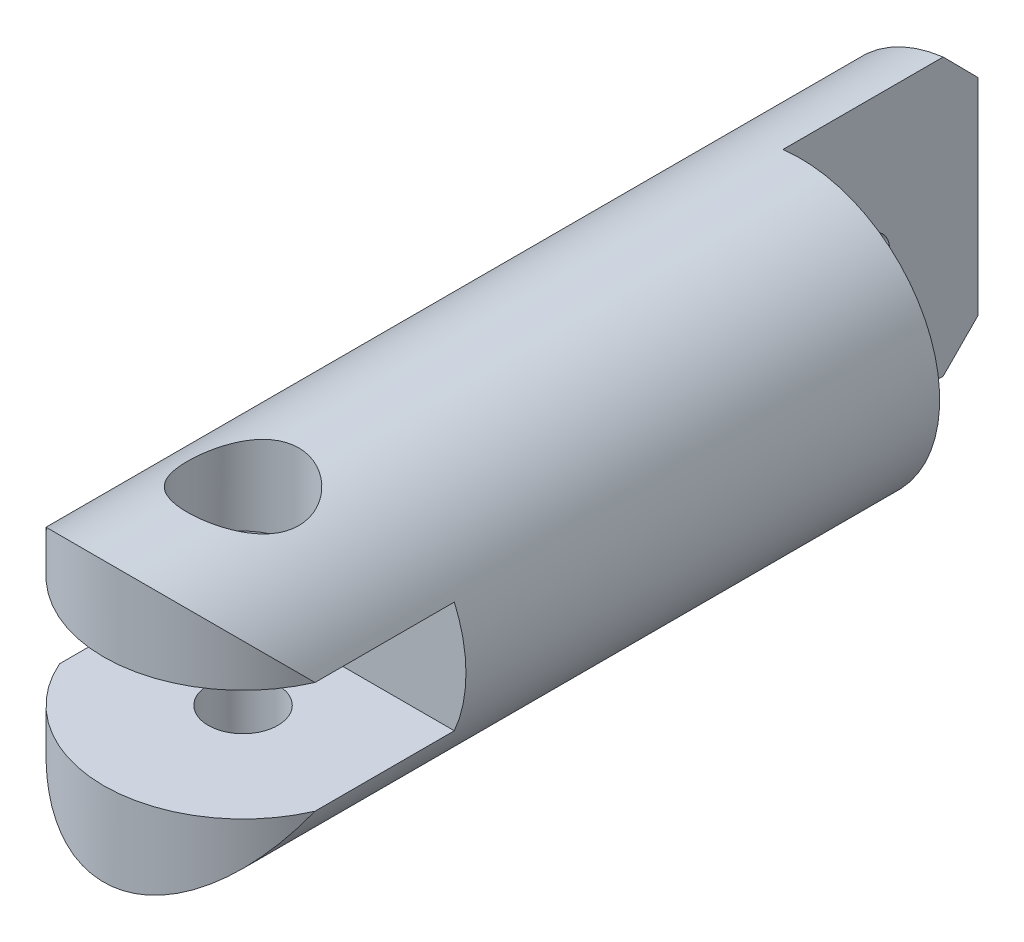
ISO-10303-21;
HEADER;
FILE_DESCRIPTION(('STEP AP214'),'2;1');
FILE_NAME('part.step','',(''),(''),'','','');
FILE_SCHEMA(('AUTOMOTIVE_DESIGN { 1 0 10303 214 1 1 1 1 }'));
ENDSEC;
DATA;
#1=APPLICATION_CONTEXT('core data for automotive mechanical design processes');
#2=APPLICATION_PROTOCOL_DEFINITION('international standard','automotive_design',2000,#1);
#3=PRODUCT_CONTEXT('',#1,'mechanical');
#4=PRODUCT('Part','Part','',(#3));
#5=PRODUCT_RELATED_PRODUCT_CATEGORY('part','',(#4));
#6=PRODUCT_DEFINITION_FORMATION('','',#4);
#7=PRODUCT_DEFINITION_CONTEXT('part definition',#1,'design');
#8=PRODUCT_DEFINITION('design','',#6,#7);
#9=PRODUCT_DEFINITION_SHAPE('','',#8);
#10=(LENGTH_UNIT() NAMED_UNIT(*) SI_UNIT(.MILLI.,.METRE.));
#11=(NAMED_UNIT(*) PLANE_ANGLE_UNIT() SI_UNIT($,.RADIAN.));
#12=(NAMED_UNIT(*) SI_UNIT($,.STERADIAN.) SOLID_ANGLE_UNIT());
#13=UNCERTAINTY_MEASURE_WITH_UNIT(LENGTH_MEASURE(1.E-05),#10,'distance_accuracy_value','');
#14=(GEOMETRIC_REPRESENTATION_CONTEXT(3) GLOBAL_UNCERTAINTY_ASSIGNED_CONTEXT((#13)) GLOBAL_UNIT_ASSIGNED_CONTEXT((#10,
#11,#12)) REPRESENTATION_CONTEXT('',''));
#15=CARTESIAN_POINT('',(0.,0.,0.));
#16=DIRECTION('',(0.,0.,1.));
#17=DIRECTION('',(1.,0.,0.));
#18=AXIS2_PLACEMENT_3D('',#15,#16,#17);
#19=CARTESIAN_POINT('',(0.,87.4642784226795,54.));
#20=DIRECTION('',(0.,-1.,0.));
#21=DIRECTION('',(0.,0.,-1.));
#22=AXIS2_PLACEMENT_3D('',#19,#20,#21);
#23=CYLINDRICAL_SURFACE('',#22,10.);
#24=CARTESIAN_POINT('',(0.,-3.99999999999999,54.));
#25=DIRECTION('',(0.,1.,0.));
#26=DIRECTION('',(0.,0.,1.));
#27=AXIS2_PLACEMENT_3D('',#24,#25,#26);
#28=CIRCLE('',#27,10.);
#29=CARTESIAN_POINT('',(-9.16515138991168,-3.99999999999999,58.));
#30=VERTEX_POINT('',#29);
#31=CARTESIAN_POINT('',(9.16515138991168,-3.99999999999999,58.));
#32=VERTEX_POINT('',#31);
#33=EDGE_CURVE('E94',#30,#32,#28,.T.);
#34=ORIENTED_EDGE('',*,*,#33,.F.);
#35=CARTESIAN_POINT('',(0.,0.,54.));
#36=DIRECTION('',(0.,-0.707106781186547,-0.707106781186547));
#37=DIRECTION('',(0.,0.707106781186547,-0.707106781186547));
#38=AXIS2_PLACEMENT_3D('',#35,#36,#37);
#39=ELLIPSE('',#38,14.1421356237309,10.);
#40=EDGE_CURVE('E92',#32,#30,#39,.T.);
#41=ORIENTED_EDGE('',*,*,#40,.F.);
#42=EDGE_LOOP('',(#34,#41));
#43=FACE_BOUND('',#42,.T.);
#44=ADVANCED_FACE('F34',(#43),#23,.T.);
#45=CARTESIAN_POINT('',(0.,0.,64.));
#46=DIRECTION('',(0.,0.,-1.));
#47=DIRECTION('',(-1.,0.,0.));
#48=AXIS2_PLACEMENT_3D('',#45,#46,#47);
#49=CYLINDRICAL_SURFACE('',#48,10.);
#50=CARTESIAN_POINT('',(0.,-10.,56.5));
#51=CARTESIAN_POINT('',(0.138126814449552,-9.99999766446687,56.4999961237697));
#52=CARTESIAN_POINT('',(0.276296929717939,-9.99710963553043,56.4885140820437));
#53=CARTESIAN_POINT('',(0.548677206284221,-9.98586856383157,56.442958081155));
#54=CARTESIAN_POINT('',(0.682885078117899,-9.97751242366626,56.4088713174369));
#55=CARTESIAN_POINT('',(0.943368120304295,-9.9562604388672,56.3192679108965));
#56=CARTESIAN_POINT('',(1.06965260571667,-9.94337004736763,56.2637770021412));
#57=CARTESIAN_POINT('',(1.31112021984071,-9.91442239679369,56.1330310165919));
#58=CARTESIAN_POINT('',(1.42630297391461,-9.89836503090261,56.0577752731351));
#59=CARTESIAN_POINT('',(1.64466987883486,-9.86445689319489,55.8879986839097));
#60=CARTESIAN_POINT('',(1.74759281676843,-9.84657845246877,55.7931473750682));
#61=CARTESIAN_POINT('',(1.93624821200553,-9.8112270019656,55.5875796584849));
#62=CARTESIAN_POINT('',(2.02197872824865,-9.79375403816446,55.4768614617551));
#63=CARTESIAN_POINT('',(2.17504423799829,-9.76091292830281,55.240674622105));
#64=CARTESIAN_POINT('',(2.2420870265419,-9.74557990774685,55.1150112819854));
#65=CARTESIAN_POINT('',(2.35399484758458,-9.71915824696694,54.8537526472333));
#66=CARTESIAN_POINT('',(2.39886342573357,-9.7080689282403,54.7181589444466));
#67=CARTESIAN_POINT('',(2.46425806134127,-9.69167461160538,54.4437608363306));
#68=CARTESIAN_POINT('',(2.48525378055342,-9.68625818328352,54.30507517327));
#69=CARTESIAN_POINT('',(2.50376962511068,-9.68148937432652,54.0260523850011));
#70=CARTESIAN_POINT('',(2.50129356969685,-9.68213600713214,53.8857155321798));
#71=CARTESIAN_POINT('',(2.47331087439951,-9.68932009194695,53.6109736537577));
#72=CARTESIAN_POINT('',(2.44836390031772,-9.69571438345489,53.4765072975578));
#73=CARTESIAN_POINT('',(2.37704031150499,-9.71344516118448,53.2137315818149));
#74=CARTESIAN_POINT('',(2.33066217011566,-9.72478199948731,53.0854226616185));
#75=CARTESIAN_POINT('',(2.21731579656198,-9.75125189842765,52.8371033062464));
#76=CARTESIAN_POINT('',(2.1501444453882,-9.76642212449693,52.717189713684));
#77=CARTESIAN_POINT('',(1.99726046002491,-9.79882851409985,52.4901354837386));
#78=CARTESIAN_POINT('',(1.91154458134806,-9.81606503891046,52.3829970865546));
#79=CARTESIAN_POINT('',(1.72110570780203,-9.85126467566485,52.181327307176));
#80=CARTESIAN_POINT('',(1.61591043027643,-9.86923449130001,52.0872425165644));
#81=CARTESIAN_POINT('',(1.39101986250616,-9.90343275964594,51.9179645958935));
#82=CARTESIAN_POINT('',(1.27132412951324,-9.91966115915679,51.8427720428941));
#83=CARTESIAN_POINT('',(1.02019314780232,-9.9486288682365,51.7132490229594));
#84=CARTESIAN_POINT('',(0.888718988681037,-9.96135600212878,51.6589910995759));
#85=CARTESIAN_POINT('',(0.618126680238139,-9.98179861652361,51.5734711571507));
#86=CARTESIAN_POINT('',(0.479009998584143,-9.98951505565468,51.5422047393031));
#87=CARTESIAN_POINT('',(0.200899950650048,-9.99892498785624,51.5042373907353));
#88=CARTESIAN_POINT('',(0.0619945333136865,-10.0007675584713,51.4969282898745));
#89=CARTESIAN_POINT('',(-0.215054791335845,-9.99864674690754,51.5054150034258));
#90=CARTESIAN_POINT('',(-0.353198766074325,-9.99468388736421,51.5212087379986));
#91=CARTESIAN_POINT('',(-0.622690447960815,-9.98149301878918,51.5749515139856));
#92=CARTESIAN_POINT('',(-0.754108531614581,-9.97234390309647,51.6125687724616));
#93=CARTESIAN_POINT('',(-1.00876215408752,-9.94981177723595,51.7085118067141));
#94=CARTESIAN_POINT('',(-1.13199686505442,-9.93642833949965,51.7668396738554));
#95=CARTESIAN_POINT('',(-1.36920522404972,-9.9065551321037,51.9037268814578));
#96=CARTESIAN_POINT('',(-1.48297573639294,-9.89001445610999,51.9826268539943));
#97=CARTESIAN_POINT('',(-1.69587768940552,-9.85574181979586,52.1579831813286));
#98=CARTESIAN_POINT('',(-1.79500659828875,-9.83800965421577,52.2544425660294));
#99=CARTESIAN_POINT('',(-1.97831761345414,-9.80281594932498,52.4650032680728));
#100=CARTESIAN_POINT('',(-2.06207311270184,-9.78537173637463,52.5794795049993));
#101=CARTESIAN_POINT('',(-2.20918459835604,-9.75321463970069,52.8212210574476));
#102=CARTESIAN_POINT('',(-2.27254149026901,-9.73850163474941,52.9484858049507));
#103=CARTESIAN_POINT('',(-2.37658570101223,-9.71363491194665,53.2115095373437));
#104=CARTESIAN_POINT('',(-2.41740732773931,-9.70345425375808,53.3472127138538));
#105=CARTESIAN_POINT('',(-2.47557609990489,-9.68877906706585,53.6238493964255));
#106=CARTESIAN_POINT('',(-2.49292837912652,-9.68428329504044,53.7647817517024));
#107=CARTESIAN_POINT('',(-2.50339765056083,-9.68158168701612,54.0435350397693));
#108=CARTESIAN_POINT('',(-2.49719649630132,-9.68319887888034,54.1813290585441));
#109=CARTESIAN_POINT('',(-2.46229546385366,-9.69213181672143,54.4538398144438));
#110=CARTESIAN_POINT('',(-2.43359603781099,-9.69944744817731,54.5885566133553));
#111=CARTESIAN_POINT('',(-2.35488553240496,-9.71885434473221,54.8503474317764));
#112=CARTESIAN_POINT('',(-2.30500234113404,-9.73091692061056,54.9774621754005));
#113=CARTESIAN_POINT('',(-2.18544152267504,-9.75846259540839,55.2216089711893));
#114=CARTESIAN_POINT('',(-2.11576115005696,-9.77394616867808,55.3386396219781));
#115=CARTESIAN_POINT('',(-1.95644624772858,-9.80709390439337,55.5625910483368));
#116=CARTESIAN_POINT('',(-1.86633860485376,-9.82480441386302,55.6691684557066));
#117=CARTESIAN_POINT('',(-1.66964895198289,-9.86013378743769,55.8659117413257));
#118=CARTESIAN_POINT('',(-1.56306303543524,-9.87775262878422,55.9560737168549));
#119=CARTESIAN_POINT('',(-1.33411264450432,-9.91129426079449,56.1190188476077));
#120=CARTESIAN_POINT('',(-1.21149737052731,-9.92718055609783,56.1914576894526));
#121=CARTESIAN_POINT('',(-0.955443432517461,-9.95508208291861,56.3145791049009));
#122=CARTESIAN_POINT('',(-0.822012605727901,-9.96710008666301,56.3652772677476));
#123=CARTESIAN_POINT('',(-0.574017088739122,-9.98413432609236,56.4359530505494));
#124=CARTESIAN_POINT('',(-0.460633618180116,-9.99004308421151,56.4599187384224));
#125=CARTESIAN_POINT('',(-0.231510119227139,-9.9979767538658,56.4919432393699));
#126=CARTESIAN_POINT('',(-0.115770268737694,-10.0000019575149,56.5000032488422));
#127=CARTESIAN_POINT('',(0.,-10.,56.5));
#128=B_SPLINE_CURVE_WITH_KNOTS('',3,(#50,#51,#52,#53,#54,#55,#56,#57,#58,#59,#60,#61,#62,#63,
#64,#65,#66,#67,#68,#69,#70,#71,#72,#73,#74,#75,#76,#77,#78,#79,#80,#81,#82,#83,#84,#85,#86,#87,
#88,#89,#90,#91,#92,#93,#94,#95,#96,#97,#98,#99,#100,#101,#102,#103,#104,#105,#106,#107,#108,
#109,#110,#111,#112,#113,#114,#115,#116,#117,#118,#119,#120,#121,#122,#123,#124,#125,#126,#127),
.UNSPECIFIED.,.T.,.F.,(4,2,2,2,2,2,2,2,2,2,2,2,2,2,2,2,2,2,2,2,2,2,2,2,2,2,2,2,2,2,2,2,2,2,2,2,
2,2,4),(0.,0.413956187453149,0.828147062939833,1.24184150381018,1.65554990028222,
2.07690725728565,2.4983121596677,2.92597745909679,3.35357435282282,3.77260491835116,
4.19156730193363,4.60037495017232,5.00921172448932,5.42217546462,5.8352115139914,
6.26002501620567,6.6848514926928,7.11113715020725,7.53734122819939,7.95263848254328,
8.36789835193439,8.7770045752893,9.18615212209352,9.60255979281121,10.0190393835223,
10.4457418201299,10.8724253125471,11.2965375769764,11.7205570543048,12.1323963400748,
12.5442273493652,12.9536066760888,13.3630428023797,13.7831596069298,14.2033761629383,
14.6312030917578,15.0587227304538,15.4057040491338,15.752659267482),.UNSPECIFIED.);
#129=CARTESIAN_POINT('',(0.,-10.,56.5));
#130=VERTEX_POINT('',#129);
#131=EDGE_CURVE('E312',#130,#130,#128,.T.);
#132=ORIENTED_EDGE('',*,*,#131,.T.);
#133=EDGE_LOOP('',(#132));
#134=FACE_BOUND('',#133,.T.);
#135=CARTESIAN_POINT('',(0.,10.,58.));
#136=CARTESIAN_POINT('',(0.107549581345536,9.99999886871264,57.9999984250671));
#137=CARTESIAN_POINT('',(0.21513214794036,9.99825999367799,57.9956563289198));
#138=CARTESIAN_POINT('',(0.429535200549547,9.99134740691108,57.9783266172161));
#139=CARTESIAN_POINT('',(0.5363551627033,9.98617152790588,57.9653335465974));
#140=CARTESIAN_POINT('',(0.748635856497415,9.97250573560118,57.9307919654494));
#141=CARTESIAN_POINT('',(0.854093134440868,9.96400865312143,57.9092249453802));
#142=CARTESIAN_POINT('',(1.0626676111401,9.94393017211573,57.8577582695632));
#143=CARTESIAN_POINT('',(1.16578384227259,9.93234752254499,57.8278552337447));
#144=CARTESIAN_POINT('',(1.46979509681069,9.89349112162205,57.726277191284));
#145=CARTESIAN_POINT('',(1.66629107461992,9.86204458846134,57.6425781809936));
#146=CARTESIAN_POINT('',(2.04217417878102,9.79113035538708,57.4459537826502));
#147=CARTESIAN_POINT('',(2.22156721456799,9.75166544086262,57.3330385398851));
#148=CARTESIAN_POINT('',(2.56699339938209,9.66661825353091,57.0755312454783));
#149=CARTESIAN_POINT('',(2.73212223266508,9.62084608086599,56.9297872894244));
#150=CARTESIAN_POINT('',(3.03635232313263,9.52921139577231,56.613199390848));
#151=CARTESIAN_POINT('',(3.17544084661153,9.48334885017047,56.4423432409835));
#152=CARTESIAN_POINT('',(3.42974847409894,9.39445587657958,56.0711440314337));
#153=CARTESIAN_POINT('',(3.54362978572887,9.35164233015934,55.8698270739363));
#154=CARTESIAN_POINT('',(3.73550961465234,9.2766729328807,55.4489271571991));
#155=CARTESIAN_POINT('',(3.81352517485723,9.24451202207145,55.2293529322586));
#156=CARTESIAN_POINT('',(3.92779760260541,9.19652715590089,54.7885753443142));
#157=CARTESIAN_POINT('',(3.96578791979826,9.18002840771385,54.5678975319119));
#158=CARTESIAN_POINT('',(4.00434593508728,9.16328008038142,54.1227300003227));
#159=CARTESIAN_POINT('',(4.00493203570086,9.16302251073202,53.8982422099889));
#160=CARTESIAN_POINT('',(3.9699787321474,9.17821000534301,53.4684866577768));
#161=CARTESIAN_POINT('',(3.93695062778272,9.19256349925666,53.2629685712343));
#162=CARTESIAN_POINT('',(3.83989376129508,9.23352375055553,52.8606808876497));
#163=CARTESIAN_POINT('',(3.77585958980135,9.26013264599921,52.6639128236937));
#164=CARTESIAN_POINT('',(3.6173894649114,9.32318970221162,52.2799643277081));
#165=CARTESIAN_POINT('',(3.52235972457939,9.35982758573424,52.0930615219175));
#166=CARTESIAN_POINT('',(3.30501292151569,9.43876232767927,51.73716836725));
#167=CARTESIAN_POINT('',(3.1826856102159,9.48106130910411,51.5681847811869));
#168=CARTESIAN_POINT('',(2.90310119889356,9.57053473488081,51.239180542404));
#169=CARTESIAN_POINT('',(2.74387492593717,9.61783329953252,51.0808625411101));
#170=CARTESIAN_POINT('',(2.40062885486449,9.70919649915614,50.7926310439938));
#171=CARTESIAN_POINT('',(2.21660413066998,9.75326048890393,50.6627232051788));
#172=CARTESIAN_POINT('',(1.82415530521056,9.83429362529358,50.4327651051689));
#173=CARTESIAN_POINT('',(1.61532098269266,9.87110540190899,50.3333554376061));
#174=CARTESIAN_POINT('',(1.18204753096606,9.93229656657448,50.1716642778437));
#175=CARTESIAN_POINT('',(0.957616393699403,9.95668226924746,50.1093639248851));
#176=CARTESIAN_POINT('',(0.513791775215592,9.98912279013838,50.0271034091606));
#177=CARTESIAN_POINT('',(0.294886587971141,9.99805891667034,50.0048550914929));
#178=CARTESIAN_POINT('',(-0.143690619615706,10.0013695702126,49.9965737989427));
#179=CARTESIAN_POINT('',(-0.363362426448183,9.99574787164577,50.0105314369048));
#180=CARTESIAN_POINT('',(-0.786865478243654,9.97115134127512,50.0725835051041));
#181=CARTESIAN_POINT('',(-0.99096498354976,9.95278782691063,50.1191159607025));
#182=CARTESIAN_POINT('',(-1.38827085612275,9.90518882810983,50.242871416619));
#183=CARTESIAN_POINT('',(-1.58147582045412,9.87595194712999,50.3200983593352));
#184=CARTESIAN_POINT('',(-1.95815757162884,9.80833189541687,50.5055698793621));
#185=CARTESIAN_POINT('',(-2.14115604549353,9.76969631959847,50.6146909440947));
#186=CARTESIAN_POINT('',(-2.4868871825104,9.68746729490808,50.8598806478029));
#187=CARTESIAN_POINT('',(-2.64961168158685,9.64387186219642,50.9959600858139));
#188=CARTESIAN_POINT('',(-2.96144608598878,9.55290235277181,51.3017400259326));
#189=CARTESIAN_POINT('',(-3.10894786734725,9.50546882853787,51.4730670831408));
#190=CARTESIAN_POINT('',(-3.37350239509234,9.4148334583058,51.8388801658903));
#191=CARTESIAN_POINT('',(-3.4905501236659,9.37163231039242,52.0333700001994));
#192=CARTESIAN_POINT('',(-3.69161500286277,9.2942859982933,52.4429233896733));
#193=CARTESIAN_POINT('',(-3.77530118531766,9.2602326182174,52.6581680002435));
#194=CARTESIAN_POINT('',(-3.90459244315908,9.20647346903737,53.1014673016128));
#195=CARTESIAN_POINT('',(-3.95022562452798,9.18675711197461,53.3295124048418));
#196=CARTESIAN_POINT('',(-3.99943122157417,9.16543518780389,53.774255809844));
#197=CARTESIAN_POINT('',(-4.0057941177721,9.16262842667612,53.990589701895));
#198=CARTESIAN_POINT('',(-3.98360636538274,9.17229671415008,54.4210896927211));
#199=CARTESIAN_POINT('',(-3.9550601501471,9.18476982225497,54.6352560632825));
#200=CARTESIAN_POINT('',(-3.86614256488129,9.2225330048627,55.0466644608903));
#201=CARTESIAN_POINT('',(-3.80707437387706,9.24729672182969,55.2442408462211));
#202=CARTESIAN_POINT('',(-3.66001151041638,9.30647993934965,55.6267569617897));
#203=CARTESIAN_POINT('',(-3.57200884934551,9.34090210615105,55.8116931851113));
#204=CARTESIAN_POINT('',(-3.36374310804133,9.41797252826471,56.1752204107095));
#205=CARTESIAN_POINT('',(-3.24192140926543,9.46097893410836,56.3528418306883));
#206=CARTESIAN_POINT('',(-2.97179350239177,9.54927479921251,56.6859821426248));
#207=CARTESIAN_POINT('',(-2.82347931168581,9.59456494363941,56.84149434729));
#208=CARTESIAN_POINT('',(-2.492974124467,9.68587647140964,57.1364235925306));
#209=CARTESIAN_POINT('',(-2.30921017071955,9.73175488236392,57.2741433839823));
#210=CARTESIAN_POINT('',(-2.01716584575533,9.7949502762577,57.4560481089375));
#211=CARTESIAN_POINT('',(-1.91699501972424,9.81509269692655,57.512607063853));
#212=CARTESIAN_POINT('',(-1.7118011098248,9.85294835133019,57.6170379954053));
#213=CARTESIAN_POINT('',(-1.60678027559742,9.87066269647665,57.664913949808));
#214=CARTESIAN_POINT('',(-1.39454646904328,9.9028559935491,57.750747984685));
#215=CARTESIAN_POINT('',(-1.28740777135872,9.91738778532477,57.7888701547472));
#216=CARTESIAN_POINT('',(-1.06995577523384,9.94319722915713,57.8559213477212));
#217=CARTESIAN_POINT('',(-0.959643983352622,9.95447639837582,57.8848546573499));
#218=CARTESIAN_POINT('',(-0.736945215856838,9.97343330649399,57.933174836149));
#219=CARTESIAN_POINT('',(-0.624564263591282,9.98112017494335,57.952585911645));
#220=CARTESIAN_POINT('',(-0.398419132407604,9.99270031578293,57.9817385706662));
#221=CARTESIAN_POINT('',(-0.284655994966353,9.9965962844555,57.9914870268343));
#222=CARTESIAN_POINT('',(-0.113830463425492,9.99951445883957,57.9987858955734));
#223=CARTESIAN_POINT('',(-0.05691985126453,10.0000005987258,58.0000008335221));
#224=CARTESIAN_POINT('',(0.,10.,58.));
#225=B_SPLINE_CURVE_WITH_KNOTS('',3,(#135,#136,#137,#138,#139,#140,#141,#142,#143,#144,#145,
#146,#147,#148,#149,#150,#151,#152,#153,#154,#155,#156,#157,#158,#159,#160,#161,#162,#163,#164,
#165,#166,#167,#168,#169,#170,#171,#172,#173,#174,#175,#176,#177,#178,#179,#180,#181,#182,#183,
#184,#185,#186,#187,#188,#189,#190,#191,#192,#193,#194,#195,#196,#197,#198,#199,#200,#201,#202,
#203,#204,#205,#206,#207,#208,#209,#210,#211,#212,#213,#214,#215,#216,#217,#218,#219,#220,#221,
#222,#223,#224),.UNSPECIFIED.,.T.,.F.,(4,2,2,2,2,2,2,2,2,2,2,2,2,2,2,2,2,2,2,2,2,2,2,2,2,2,2,2,
2,2,2,2,2,2,2,2,2,2,2,2,2,2,2,2,4),(0.,0.322603993422154,0.645411604786481,0.968919914471235,
1.29255959093095,1.93701523385824,2.58124739027476,3.25313995292302,3.9253602176033,
4.62749749529941,5.32930078128044,5.99927442509164,6.66891844572484,7.29195888698824,
7.9151080641227,8.55097484497807,9.18708075776542,9.87235930273289,10.5577741757964,
11.2567305822579,11.9553314412776,12.6125760095619,13.2696501904034,13.8972014302891,
14.5248332988777,15.171662586967,15.8187515089811,16.50856181149,17.1984856998767,
17.8950932218183,18.5911857719204,19.2371857868567,19.8831037702627,20.5034786899771,
21.124025035105,21.7801016801356,22.4363763459696,23.1352007896785,23.4851924266232,
23.8350233218042,24.1785111324565,24.52183846562,24.8642884495951,25.2064946871486,
25.3772305569977),.UNSPECIFIED.);
#226=CARTESIAN_POINT('',(0.,10.,58.));
#227=VERTEX_POINT('',#226);
#228=EDGE_CURVE('E318',#227,#227,#225,.T.);
#229=ORIENTED_EDGE('',*,*,#228,.F.);
#230=EDGE_LOOP('',(#229));
#231=FACE_BOUND('',#230,.T.);
#232=CARTESIAN_POINT('',(-10.,0.,9.64813480329865));
#233=CARTESIAN_POINT('',(-9.99999841004105,-0.0918552611099884,9.65250237797199));
#234=CARTESIAN_POINT('',(-9.99872114962819,-0.184127097282017,9.64917481390867));
#235=CARTESIAN_POINT('',(-9.99368892453742,-0.36681705794547,9.62721065982617));
#236=CARTESIAN_POINT('',(-9.9899317018226,-0.45723341556845,9.60856011424828));
#237=CARTESIAN_POINT('',(-9.98030202803953,-0.63352997623666,9.55653611093335));
#238=CARTESIAN_POINT('',(-9.97443126367387,-0.719413734014383,9.52317438862569));
#239=CARTESIAN_POINT('',(-9.96116452669977,-0.884338267092171,9.44271813959329));
#240=CARTESIAN_POINT('',(-9.9537687260926,-0.963379812665289,9.39562516130105));
#241=CARTESIAN_POINT('',(-9.93814110363959,-1.11313742981527,9.28857611629304));
#242=CARTESIAN_POINT('',(-9.92990276062281,-1.18377771287134,9.22851497577605));
#243=CARTESIAN_POINT('',(-9.91350774991506,-1.31403319212547,9.09741990120554));
#244=CARTESIAN_POINT('',(-9.90535108834665,-1.37364756762447,9.02638515106733));
#245=CARTESIAN_POINT('',(-9.88993239942898,-1.48060398927923,8.87469536836294));
#246=CARTESIAN_POINT('',(-9.88267765448742,-1.52784916639881,8.79397122352968));
#247=CARTESIAN_POINT('',(-9.86994074855457,-1.60808231138026,8.62559346899119));
#248=CARTESIAN_POINT('',(-9.86445847980457,-1.64107114600561,8.53794028094445));
#249=CARTESIAN_POINT('',(-9.85592437672223,-1.69157044027441,8.35896816524967));
#250=CARTESIAN_POINT('',(-9.85285241586151,-1.70920921419107,8.2676864295038));
#251=CARTESIAN_POINT('',(-9.84941213992169,-1.72892565774226,8.08341059960488));
#252=CARTESIAN_POINT('',(-9.84904359234922,-1.73100466551602,7.99041665339142));
#253=CARTESIAN_POINT('',(-9.8510391309876,-1.71960988429729,7.806565466667));
#254=CARTESIAN_POINT('',(-9.85336982846283,-1.70632613021858,7.71569600482927));
#255=CARTESIAN_POINT('',(-9.8604490838806,-1.66492644225766,7.53750174045703));
#256=CARTESIAN_POINT('',(-9.86519769046645,-1.63681020997638,7.45017700927329));
#257=CARTESIAN_POINT('',(-9.87660745531201,-1.56648958155497,7.2812662751147));
#258=CARTESIAN_POINT('',(-9.88327362132467,-1.52424824982782,7.19969600378051));
#259=CARTESIAN_POINT('',(-9.89779607878831,-1.42690093718692,7.04474801139617));
#260=CARTESIAN_POINT('',(-9.90565247178386,-1.37179385841095,6.97137099028426));
#261=CARTESIAN_POINT('',(-9.92183691496284,-1.2494014874135,6.83384467668258));
#262=CARTESIAN_POINT('',(-9.93016989281809,-1.18196215660373,6.76983299186507));
#263=CARTESIAN_POINT('',(-9.94632441494592,-1.03726609572498,6.65399572028212));
#264=CARTESIAN_POINT('',(-9.95414594394336,-0.960009072639481,6.60217049736256));
#265=CARTESIAN_POINT('',(-9.96848751025189,-0.797453953676585,6.51198705479669));
#266=CARTESIAN_POINT('',(-9.97500196551247,-0.712123568095622,6.47368608515124));
#267=CARTESIAN_POINT('',(-9.98600801183317,-0.536107455069284,6.41200491150955));
#268=CARTESIAN_POINT('',(-9.99049975603821,-0.445422133648844,6.38862357785138));
#269=CARTESIAN_POINT('',(-9.99697452312288,-0.262301649313944,6.35767763851051));
#270=CARTESIAN_POINT('',(-9.99898381507035,-0.169895500559801,6.34994685161383));
#271=CARTESIAN_POINT('',(-10.0004157794774,0.0149249944558875,6.35005369226964));
#272=CARTESIAN_POINT('',(-9.99983859880803,0.107339339953998,6.35789043581693));
#273=CARTESIAN_POINT('',(-9.99623985462426,0.288699842110435,6.38875784270913));
#274=CARTESIAN_POINT('',(-9.99323989079575,0.377669395562504,6.4116539152198));
#275=CARTESIAN_POINT('',(-9.98521078553941,0.550505466771833,6.47182749270055));
#276=CARTESIAN_POINT('',(-9.98018156723504,0.634371791059187,6.50910554251691));
#277=CARTESIAN_POINT('',(-9.96866283454471,0.79517616216943,6.59723004953345));
#278=CARTESIAN_POINT('',(-9.96216490181238,0.872070538964065,6.64815505340095));
#279=CARTESIAN_POINT('',(-9.94848802242876,1.0162885727631,6.76204618031837));
#280=CARTESIAN_POINT('',(-9.94130902518914,1.08361151788784,6.82501319818272));
#281=CARTESIAN_POINT('',(-9.92702288343666,1.2075427410127,6.96202455771366));
#282=CARTESIAN_POINT('',(-9.91991739925995,1.26402494274577,7.03618318564652));
#283=CARTESIAN_POINT('',(-9.90670087170131,1.36375129293445,7.19300562780569));
#284=CARTESIAN_POINT('',(-9.90058981978805,1.40699555496223,7.275669369056));
#285=CARTESIAN_POINT('',(-9.89009725724269,1.47895402978537,7.44711553744691));
#286=CARTESIAN_POINT('',(-9.88571418321168,1.50768138350852,7.53589234791301));
#287=CARTESIAN_POINT('',(-9.87920072871744,1.54979119088063,7.7170916653621));
#288=CARTESIAN_POINT('',(-9.87707017034147,1.56317485644286,7.80951388381789));
#289=CARTESIAN_POINT('',(-9.87533140457753,1.57412207256648,7.99427922924563));
#290=CARTESIAN_POINT('',(-9.87569540147448,1.57185995449539,8.0866117988146));
#291=CARTESIAN_POINT('',(-9.87883620566196,1.55199679654419,8.26956750490724));
#292=CARTESIAN_POINT('',(-9.88161297321671,1.53439600927568,8.36019066955787));
#293=CARTESIAN_POINT('',(-9.8892352905294,1.48447115894788,8.53687355067294));
#294=CARTESIAN_POINT('',(-9.89407417295388,1.45219452424944,8.62294697806679));
#295=CARTESIAN_POINT('',(-9.90525264026929,1.37387301833982,8.78847515937234));
#296=CARTESIAN_POINT('',(-9.91159228190012,1.3278276265496,8.86792966288578));
#297=CARTESIAN_POINT('',(-9.92510587447255,1.22274218226875,9.01881267788749));
#298=CARTESIAN_POINT('',(-9.93228739744642,1.16357912493684,9.0901548409393));
#299=CARTESIAN_POINT('',(-9.94659616179632,1.03414434119539,9.22196807292577));
#300=CARTESIAN_POINT('',(-9.95372338997979,0.963869999869851,9.28243657568893));
#301=CARTESIAN_POINT('',(-9.96713623346578,0.813586636036327,9.39121255455585));
#302=CARTESIAN_POINT('',(-9.97341515802561,0.733508760146892,9.4394257283166));
#303=CARTESIAN_POINT('',(-9.98430072483789,0.566328461117266,9.5216582248694));
#304=CARTESIAN_POINT('',(-9.98890901967395,0.479233084517041,9.55569157931435));
#305=CARTESIAN_POINT('',(-9.99486818716543,0.326565312821448,9.60088990929782));
#306=CARTESIAN_POINT('',(-9.99677672749031,0.262104690294658,9.61582756646564));
#307=CARTESIAN_POINT('',(-9.99934319518033,0.131834440074982,9.63788026091949));
#308=CARTESIAN_POINT('',(-10.0000011428499,0.0660248343015031,9.64499542520944));
#309=CARTESIAN_POINT('',(-10.,0.,9.64813480329865));
#310=B_SPLINE_CURVE_WITH_KNOTS('',3,(#232,#233,#234,#235,#236,#237,#238,#239,#240,#241,#242,
#243,#244,#245,#246,#247,#248,#249,#250,#251,#252,#253,#254,#255,#256,#257,#258,#259,#260,#261,
#262,#263,#264,#265,#266,#267,#268,#269,#270,#271,#272,#273,#274,#275,#276,#277,#278,#279,#280,
#281,#282,#283,#284,#285,#286,#287,#288,#289,#290,#291,#292,#293,#294,#295,#296,#297,#298,#299,
#300,#301,#302,#303,#304,#305,#306,#307,#308,#309),.UNSPECIFIED.,.T.,.F.,(4,2,2,2,2,2,2,2,2,2,2,
2,2,2,2,2,2,2,2,2,2,2,2,2,2,2,2,2,2,2,2,2,2,2,2,2,2,2,4),(0.,0.275635761638901,
0.551522839955611,0.827190234099952,1.10282655407467,1.3807861370597,1.65876640128528,
1.93886260607641,2.21894177905668,2.49665658261794,2.77434750244326,3.04863984093003,
3.32293769782709,3.59795849668645,3.87300277225287,4.15175181013469,4.43050916944877,
4.71043278566934,4.99033520455072,5.26724962715061,5.54414832556127,5.81860530439709,
6.09307268177163,6.36915504147141,6.64525792419472,6.92439949734277,7.20353867558631,
7.48242471809361,7.76128873141315,8.03705057973858,8.3128078866448,8.58768028609395,
8.86256307943013,9.14014152835411,9.41778539974971,9.69750508310771,9.97694730839668,
10.1750753279573,10.3732001307161),.UNSPECIFIED.);
#311=CARTESIAN_POINT('',(-10.,0.,9.64813480329865));
#312=VERTEX_POINT('',#311);
#313=EDGE_CURVE('E138',#312,#312,#310,.T.);
#314=ORIENTED_EDGE('',*,*,#313,.T.);
#315=EDGE_LOOP('',(#314));
#316=FACE_BOUND('',#315,.T.);
#317=CARTESIAN_POINT('',(0.,0.,54.));
#318=DIRECTION('',(0.,0.707106781186547,-0.707106781186547));
#319=DIRECTION('',(0.,-0.707106781186547,-0.707106781186547));
#320=AXIS2_PLACEMENT_3D('',#317,#318,#319);
#321=ELLIPSE('',#320,14.1421356237309,10.);
#322=CARTESIAN_POINT('',(-9.16515138991168,4.,58.));
#323=VERTEX_POINT('',#322);
#324=CARTESIAN_POINT('',(9.16515138991168,4.00000000000001,58.));
#325=VERTEX_POINT('',#324);
#326=EDGE_CURVE('E96',#323,#325,#321,.T.);
#327=ORIENTED_EDGE('',*,*,#326,.T.);
#328=DIRECTION('',(0.,0.,-1.));
#329=VECTOR('',#328,1.);
#330=CARTESIAN_POINT('',(9.16515138991168,4.,64.));
#331=LINE('',#330,#329);
#332=CARTESIAN_POINT('',(9.16515138991168,4.,48.));
#333=VERTEX_POINT('',#332);
#334=EDGE_CURVE('E124',#325,#333,#331,.T.);
#335=ORIENTED_EDGE('',*,*,#334,.T.);
#336=CARTESIAN_POINT('',(0.,0.,48.));
#337=DIRECTION('',(0.,0.,-1.));
#338=DIRECTION('',(-1.,0.,0.));
#339=AXIS2_PLACEMENT_3D('',#336,#337,#338);
#340=CIRCLE('',#339,10.);
#341=CARTESIAN_POINT('',(9.16515138991168,-3.99999999999999,48.));
#342=VERTEX_POINT('',#341);
#343=EDGE_CURVE('E11',#333,#342,#340,.T.);
#344=ORIENTED_EDGE('',*,*,#343,.T.);
#345=DIRECTION('',(0.,0.,-1.));
#346=VECTOR('',#345,1.);
#347=CARTESIAN_POINT('',(9.16515138991168,-3.99999999999999,64.));
#348=LINE('',#347,#346);
#349=EDGE_CURVE('E99',#32,#342,#348,.T.);
#350=ORIENTED_EDGE('',*,*,#349,.F.);
#351=ORIENTED_EDGE('',*,*,#40,.T.);
#352=DIRECTION('',(0.,0.,-1.));
#353=VECTOR('',#352,1.);
#354=CARTESIAN_POINT('',(-9.16515138991168,-3.99999999999999,64.));
#355=LINE('',#354,#353);
#356=CARTESIAN_POINT('',(-9.16515138991168,-3.99999999999999,48.));
#357=VERTEX_POINT('',#356);
#358=EDGE_CURVE('E105',#357,#30,#355,.F.);
#359=ORIENTED_EDGE('',*,*,#358,.F.);
#360=CARTESIAN_POINT('',(-9.16515138991168,4.,48.));
#361=VERTEX_POINT('',#360);
#362=EDGE_CURVE('E44',#357,#361,#340,.T.);
#363=ORIENTED_EDGE('',*,*,#362,.T.);
#364=DIRECTION('',(0.,0.,-1.));
#365=VECTOR('',#364,1.);
#366=CARTESIAN_POINT('',(-9.16515138991168,4.,64.));
#367=LINE('',#366,#365);
#368=EDGE_CURVE('E104',#361,#323,#367,.F.);
#369=ORIENTED_EDGE('',*,*,#368,.T.);
#370=EDGE_LOOP('',(#327,#335,#344,#350,#351,#359,#363,#369));
#371=FACE_BOUND('',#370,.T.);
#372=DIRECTION('',(0.,0.,-1.));
#373=VECTOR('',#372,1.);
#374=CARTESIAN_POINT('',(-1.25000000000001,9.92156741649221,64.));
#375=LINE('',#374,#373);
#376=CARTESIAN_POINT('',(-1.25000000000001,9.92156741649221,2.5));
#377=VERTEX_POINT('',#376);
#378=CARTESIAN_POINT('',(-1.25000000000001,9.92156741649221,14.));
#379=VERTEX_POINT('',#378);
#380=EDGE_CURVE('E190',#377,#379,#375,.F.);
#381=ORIENTED_EDGE('',*,*,#380,.F.);
#382=CARTESIAN_POINT('',(0.,0.,2.5));
#383=DIRECTION('',(0.,0.,1.));
#384=DIRECTION('',(1.,0.,0.));
#385=AXIS2_PLACEMENT_3D('',#382,#383,#384);
#386=CIRCLE('',#385,10.);
#387=CARTESIAN_POINT('',(-1.25000000000001,-9.92156741649221,2.5));
#388=VERTEX_POINT('',#387);
#389=EDGE_CURVE('E178',#377,#388,#386,.T.);
#390=ORIENTED_EDGE('',*,*,#389,.T.);
#391=DIRECTION('',(0.,0.,-1.));
#392=VECTOR('',#391,1.);
#393=CARTESIAN_POINT('',(-1.25000000000001,-9.92156741649221,64.));
#394=LINE('',#393,#392);
#395=CARTESIAN_POINT('',(-1.25,-9.92156741649221,14.));
#396=VERTEX_POINT('',#395);
#397=EDGE_CURVE('E97',#396,#388,#394,.T.);
#398=ORIENTED_EDGE('',*,*,#397,.F.);
#399=CARTESIAN_POINT('',(0.,0.,14.));
#400=DIRECTION('',(0.,0.,-1.));
#401=DIRECTION('',(-1.,0.,0.));
#402=AXIS2_PLACEMENT_3D('',#399,#400,#401);
#403=CIRCLE('',#402,10.);
#404=EDGE_CURVE('E182',#379,#396,#403,.T.);
#405=ORIENTED_EDGE('',*,*,#404,.F.);
#406=EDGE_LOOP('',(#381,#390,#398,#405));
#407=FACE_BOUND('',#406,.T.);
#408=ADVANCED_FACE('F36',(#134,#231,#316,#371,#407),#49,.T.);
#409=CARTESIAN_POINT('',(0.,0.,0.));
#410=DIRECTION('',(0.,0.,1.));
#411=DIRECTION('',(1.,0.,0.));
#412=AXIS2_PLACEMENT_3D('',#409,#410,#411);
#413=PLANE('',#412);
#414=DIRECTION('',(0.,1.,0.));
#415=VECTOR('',#414,1.);
#416=CARTESIAN_POINT('',(-1.25,0.,0.));
#417=LINE('',#416,#415);
#418=CARTESIAN_POINT('',(-1.25,-7.39509972887452,0.));
#419=VERTEX_POINT('',#418);
#420=CARTESIAN_POINT('',(-1.25,7.39509972887452,0.));
#421=VERTEX_POINT('',#420);
#422=EDGE_CURVE('E185',#419,#421,#417,.T.);
#423=ORIENTED_EDGE('',*,*,#422,.F.);
#424=CARTESIAN_POINT('',(0.,0.,0.));
#425=DIRECTION('',(0.,0.,1.));
#426=DIRECTION('',(1.,0.,0.));
#427=AXIS2_PLACEMENT_3D('',#424,#425,#426);
#428=CIRCLE('',#427,7.5);
#429=EDGE_CURVE('E109',#419,#421,#428,.F.);
#430=ORIENTED_EDGE('',*,*,#429,.T.);
#431=EDGE_LOOP('',(#423,#430));
#432=FACE_BOUND('',#431,.T.);
#433=ADVANCED_FACE('F198',(#432),#413,.F.);
#434=ORIENTED_EDGE('',*,*,#326,.F.);
#435=CARTESIAN_POINT('',(0.,4.,54.));
#436=DIRECTION('',(0.,1.,0.));
#437=DIRECTION('',(-1.,0.,0.));
#438=AXIS2_PLACEMENT_3D('',#435,#436,#437);
#439=CIRCLE('',#438,10.);
#440=EDGE_CURVE('E108',#323,#325,#439,.T.);
#441=ORIENTED_EDGE('',*,*,#440,.T.);
#442=EDGE_LOOP('',(#434,#441));
#443=FACE_BOUND('',#442,.T.);
#444=ADVANCED_FACE('F200',(#443),#23,.T.);
#445=CARTESIAN_POINT('',(-1.25,87.4642784226795,14.));
#446=DIRECTION('',(0.,0.,-1.));
#447=DIRECTION('',(-1.,0.,0.));
#448=AXIS2_PLACEMENT_3D('',#445,#446,#447);
#449=PLANE('',#448);
#450=DIRECTION('',(0.,-1.,0.));
#451=VECTOR('',#450,1.);
#452=CARTESIAN_POINT('',(-1.25,87.4642784226795,14.));
#453=LINE('',#452,#451);
#454=EDGE_CURVE('E145',#379,#396,#453,.T.);
#455=ORIENTED_EDGE('',*,*,#454,.F.);
#456=ORIENTED_EDGE('',*,*,#404,.T.);
#457=EDGE_LOOP('',(#455,#456));
#458=FACE_BOUND('',#457,.T.);
#459=ADVANCED_FACE('F195',(#458),#449,.T.);
#460=CARTESIAN_POINT('',(-1.25,87.4642784226795,-12.1846444081055));
#461=DIRECTION('',(1.,0.,0.));
#462=DIRECTION('',(0.,0.,-1.));
#463=AXIS2_PLACEMENT_3D('',#460,#461,#462);
#464=PLANE('',#463);
#465=CARTESIAN_POINT('',(-1.25,-0.0784325835077888,8.));
#466=DIRECTION('',(1.,0.,0.));
#467=DIRECTION('',(0.,0.,-1.));
#468=AXIS2_PLACEMENT_3D('',#465,#466,#467);
#469=CIRCLE('',#468,1.65);
#470=CARTESIAN_POINT('',(-1.25,-0.0784325835077888,6.35));
#471=VERTEX_POINT('',#470);
#472=EDGE_CURVE('E135',#471,#471,#469,.T.);
#473=ORIENTED_EDGE('',*,*,#472,.F.);
#474=EDGE_LOOP('',(#473));
#475=FACE_BOUND('',#474,.T.);
#476=ORIENTED_EDGE('',*,*,#397,.T.);
#477=CARTESIAN_POINT('',(-1.25000000000001,-9.92156741649221,2.5));
#478=CARTESIAN_POINT('',(-1.25,-9.71130427054973,2.2913880679325));
#479=CARTESIAN_POINT('',(-1.25,-9.50099135614393,2.08282626982838));
#480=CARTESIAN_POINT('',(-1.25,-9.08023916702428,1.66583042218465));
#481=CARTESIAN_POINT('',(-1.25,-8.86979989238393,1.45739637257089));
#482=CARTESIAN_POINT('',(-1.25,-8.44876786727853,1.04068321269392));
#483=CARTESIAN_POINT('',(-1.25,-8.23817511677859,0.832404102465952));
#484=CARTESIAN_POINT('',(-1.25,-7.81679431011537,0.416043309463366));
#485=CARTESIAN_POINT('',(-1.25,-7.60600625383803,0.207961626804187));
#486=CARTESIAN_POINT('',(-1.25,-7.39509972887452,0.));
#487=B_SPLINE_CURVE_WITH_KNOTS('',3,(#477,#478,#479,#480,#481,#482,#483,#484,#485,#486),
.UNSPECIFIED.,.F.,.F.,(4,2,2,2,4),(0.,0.88857514781321,1.77714977934884,2.66572461291902,
3.55429996571153),.UNSPECIFIED.);
#488=EDGE_CURVE('E112',#388,#419,#487,.T.);
#489=ORIENTED_EDGE('',*,*,#488,.T.);
#490=ORIENTED_EDGE('',*,*,#422,.T.);
#491=CARTESIAN_POINT('',(-1.25,7.39509972887452,0.));
#492=CARTESIAN_POINT('',(-1.25,7.60600625383803,0.207961626804187));
#493=CARTESIAN_POINT('',(-1.25,7.81679431011537,0.416043309463367));
#494=CARTESIAN_POINT('',(-1.25,8.23817511677859,0.832404102465952));
#495=CARTESIAN_POINT('',(-1.25,8.44876786727853,1.04068321269392));
#496=CARTESIAN_POINT('',(-1.25,8.86979989238393,1.45739637257089));
#497=CARTESIAN_POINT('',(-1.25,9.08023916702428,1.66583042218465));
#498=CARTESIAN_POINT('',(-1.25,9.50099135614393,2.08282626982838));
#499=CARTESIAN_POINT('',(-1.25,9.71130427054974,2.2913880679325));
#500=CARTESIAN_POINT('',(-1.25,9.92156741649221,2.5));
#501=B_SPLINE_CURVE_WITH_KNOTS('',3,(#491,#492,#493,#494,#495,#496,#497,#498,#499,#500),
.UNSPECIFIED.,.F.,.F.,(4,2,2,2,4),(0.,0.888575352792509,1.77715018636269,2.66572481789832,
3.55429996571153),.UNSPECIFIED.);
#502=EDGE_CURVE('E164',#421,#377,#501,.T.);
#503=ORIENTED_EDGE('',*,*,#502,.T.);
#504=ORIENTED_EDGE('',*,*,#380,.T.);
#505=ORIENTED_EDGE('',*,*,#454,.T.);
#506=EDGE_LOOP('',(#476,#489,#490,#503,#504,#505));
#507=FACE_BOUND('',#506,.T.);
#508=ADVANCED_FACE('F158',(#475,#507),#464,.T.);
#509=CARTESIAN_POINT('',(0.,0.,2.5));
#510=DIRECTION('',(0.,0.,1.));
#511=DIRECTION('',(1.,0.,0.));
#512=AXIS2_PLACEMENT_3D('',#509,#510,#511);
#513=CONICAL_SURFACE('',#512,10.,0.785398163397448);
#514=ORIENTED_EDGE('',*,*,#502,.F.);
#515=ORIENTED_EDGE('',*,*,#429,.F.);
#516=ORIENTED_EDGE('',*,*,#488,.F.);
#517=ORIENTED_EDGE('',*,*,#389,.F.);
#518=EDGE_LOOP('',(#514,#515,#516,#517));
#519=FACE_BOUND('',#518,.T.);
#520=ADVANCED_FACE('F152',(#519),#513,.T.);
#521=CARTESIAN_POINT('',(-10.,-0.0784325835077888,7.99999999999999));
#522=DIRECTION('',(1.,0.,0.));
#523=DIRECTION('',(0.,0.,-1.));
#524=AXIS2_PLACEMENT_3D('',#521,#522,#523);
#525=CYLINDRICAL_SURFACE('',#524,1.65);
#526=ORIENTED_EDGE('',*,*,#472,.T.);
#527=EDGE_LOOP('',(#526));
#528=FACE_BOUND('',#527,.T.);
#529=ORIENTED_EDGE('',*,*,#313,.F.);
#530=EDGE_LOOP('',(#529));
#531=FACE_BOUND('',#530,.T.);
#532=ADVANCED_FACE('F147',(#528,#531),#525,.F.);
#533=CARTESIAN_POINT('',(10.,4.,48.));
#534=DIRECTION('',(0.,0.,-1.));
#535=DIRECTION('',(-1.,0.,0.));
#536=AXIS2_PLACEMENT_3D('',#533,#534,#535);
#537=PLANE('',#536);
#538=ORIENTED_EDGE('',*,*,#343,.F.);
#539=DIRECTION('',(-1.,0.,0.));
#540=VECTOR('',#539,1.);
#541=CARTESIAN_POINT('',(10.,4.,48.));
#542=LINE('',#541,#540);
#543=EDGE_CURVE('E123',#333,#361,#542,.T.);
#544=ORIENTED_EDGE('',*,*,#543,.T.);
#545=ORIENTED_EDGE('',*,*,#362,.F.);
#546=DIRECTION('',(-1.,0.,0.));
#547=VECTOR('',#546,1.);
#548=CARTESIAN_POINT('',(10.,-4.,48.));
#549=LINE('',#548,#547);
#550=EDGE_CURVE('E127',#342,#357,#549,.T.);
#551=ORIENTED_EDGE('',*,*,#550,.F.);
#552=EDGE_LOOP('',(#538,#544,#545,#551));
#553=FACE_BOUND('',#552,.T.);
#554=ADVANCED_FACE('F126',(#553),#537,.F.);
#555=CARTESIAN_POINT('',(10.,4.,68.9436834094368));
#556=DIRECTION('',(0.,1.,0.));
#557=DIRECTION('',(-1.,0.,0.));
#558=AXIS2_PLACEMENT_3D('',#555,#556,#557);
#559=PLANE('',#558);
#560=CARTESIAN_POINT('',(0.,4.,54.));
#561=DIRECTION('',(0.,1.,0.));
#562=DIRECTION('',(-1.,0.,0.));
#563=AXIS2_PLACEMENT_3D('',#560,#561,#562);
#564=CIRCLE('',#563,4.);
#565=CARTESIAN_POINT('',(-4.,4.,54.));
#566=VERTEX_POINT('',#565);
#567=EDGE_CURVE('E130',#566,#566,#564,.F.);
#568=ORIENTED_EDGE('',*,*,#567,.F.);
#569=EDGE_LOOP('',(#568));
#570=FACE_BOUND('',#569,.T.);
#571=ORIENTED_EDGE('',*,*,#334,.F.);
#572=ORIENTED_EDGE('',*,*,#440,.F.);
#573=ORIENTED_EDGE('',*,*,#368,.F.);
#574=ORIENTED_EDGE('',*,*,#543,.F.);
#575=EDGE_LOOP('',(#571,#572,#573,#574));
#576=FACE_BOUND('',#575,.T.);
#577=ADVANCED_FACE('F122',(#570,#576),#559,.F.);
#578=CARTESIAN_POINT('',(10.,-3.99999999999999,68.9436834094368));
#579=DIRECTION('',(0.,1.,0.));
#580=DIRECTION('',(0.,0.,1.));
#581=AXIS2_PLACEMENT_3D('',#578,#579,#580);
#582=PLANE('',#581);
#583=CARTESIAN_POINT('',(0.,-4.,54.));
#584=DIRECTION('',(0.,1.,0.));
#585=DIRECTION('',(0.,0.,1.));
#586=AXIS2_PLACEMENT_3D('',#583,#584,#585);
#587=CIRCLE('',#586,2.5);
#588=CARTESIAN_POINT('',(0.,-3.99999999999999,56.5));
#589=VERTEX_POINT('',#588);
#590=EDGE_CURVE('E39',#589,#589,#587,.T.);
#591=ORIENTED_EDGE('',*,*,#590,.F.);
#592=EDGE_LOOP('',(#591));
#593=FACE_BOUND('',#592,.T.);
#594=ORIENTED_EDGE('',*,*,#33,.T.);
#595=ORIENTED_EDGE('',*,*,#349,.T.);
#596=ORIENTED_EDGE('',*,*,#550,.T.);
#597=ORIENTED_EDGE('',*,*,#358,.T.);
#598=EDGE_LOOP('',(#594,#595,#596,#597));
#599=FACE_BOUND('',#598,.T.);
#600=ADVANCED_FACE('F107',(#593,#599),#582,.T.);
#601=CARTESIAN_POINT('',(0.,-10.001,54.));
#602=DIRECTION('',(0.,1.,0.));
#603=DIRECTION('',(0.,0.,1.));
#604=AXIS2_PLACEMENT_3D('',#601,#602,#603);
#605=CYLINDRICAL_SURFACE('',#604,4.);
#606=ORIENTED_EDGE('',*,*,#567,.T.);
#607=EDGE_LOOP('',(#606));
#608=FACE_BOUND('',#607,.T.);
#609=ORIENTED_EDGE('',*,*,#228,.T.);
#610=EDGE_LOOP('',(#609));
#611=FACE_BOUND('',#610,.T.);
#612=ADVANCED_FACE('F247',(#608,#611),#605,.F.);
#613=CARTESIAN_POINT('',(0.,-10.,54.));
#614=DIRECTION('',(0.,1.,0.));
#615=DIRECTION('',(0.,0.,1.));
#616=AXIS2_PLACEMENT_3D('',#613,#614,#615);
#617=CYLINDRICAL_SURFACE('',#616,2.5);
#618=ORIENTED_EDGE('',*,*,#590,.T.);
#619=EDGE_LOOP('',(#618));
#620=FACE_BOUND('',#619,.T.);
#621=ORIENTED_EDGE('',*,*,#131,.F.);
#622=EDGE_LOOP('',(#621));
#623=FACE_BOUND('',#622,.T.);
#624=ADVANCED_FACE('F255',(#620,#623),#617,.F.);
#625=CLOSED_SHELL('',(#44,#408,#433,#444,#459,#508,#520,#532,#554,#577,#600,#612,#624));
#626=MANIFOLD_SOLID_BREP('B2',#625);
#627=ADVANCED_BREP_SHAPE_REPRESENTATION('',(#18,#626),#14);
#628=SHAPE_DEFINITION_REPRESENTATION(#9,#627);
ENDSEC;
END-ISO-10303-21;
